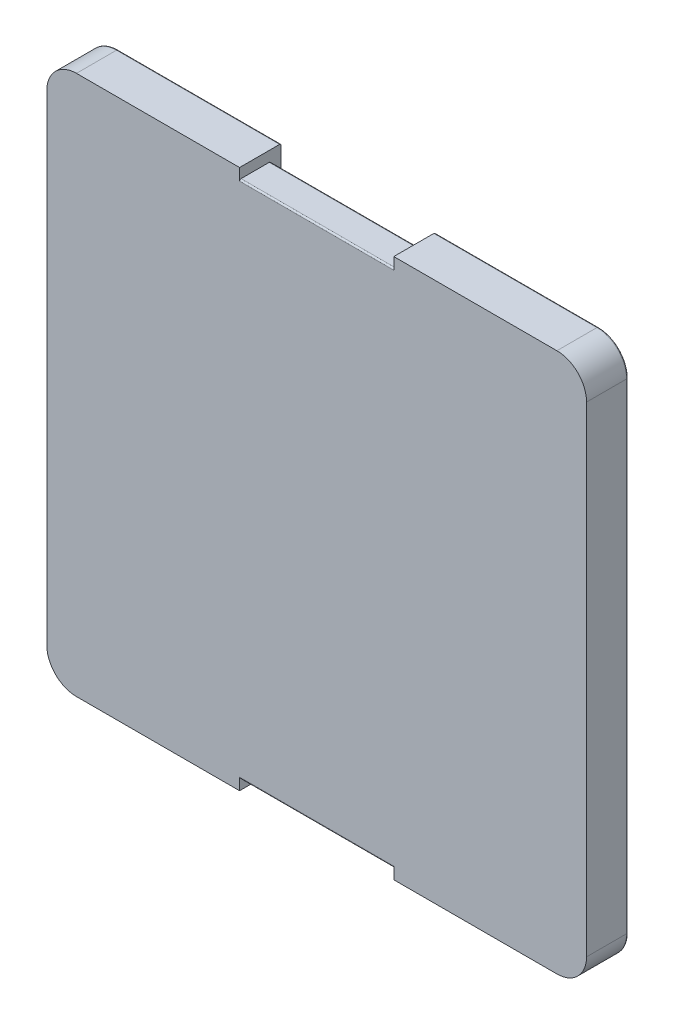
ISO-10303-21;
HEADER;
FILE_DESCRIPTION(('STEP AP214'),'2;1');
FILE_NAME('part.step','',(''),(''),'','','');
FILE_SCHEMA(('AUTOMOTIVE_DESIGN { 1 0 10303 214 1 1 1 1 }'));
ENDSEC;
DATA;
#1=APPLICATION_CONTEXT('core data for automotive mechanical design processes');
#2=APPLICATION_PROTOCOL_DEFINITION('international standard','automotive_design',2000,#1);
#3=PRODUCT_CONTEXT('',#1,'mechanical');
#4=PRODUCT('Part','Part','',(#3));
#5=PRODUCT_RELATED_PRODUCT_CATEGORY('part','',(#4));
#6=PRODUCT_DEFINITION_FORMATION('','',#4);
#7=PRODUCT_DEFINITION_CONTEXT('part definition',#1,'design');
#8=PRODUCT_DEFINITION('design','',#6,#7);
#9=PRODUCT_DEFINITION_SHAPE('','',#8);
#10=(LENGTH_UNIT() NAMED_UNIT(*) SI_UNIT(.MILLI.,.METRE.));
#11=(NAMED_UNIT(*) PLANE_ANGLE_UNIT() SI_UNIT($,.RADIAN.));
#12=(NAMED_UNIT(*) SI_UNIT($,.STERADIAN.) SOLID_ANGLE_UNIT());
#13=UNCERTAINTY_MEASURE_WITH_UNIT(LENGTH_MEASURE(1.E-05),#10,'distance_accuracy_value','');
#14=(GEOMETRIC_REPRESENTATION_CONTEXT(3) GLOBAL_UNCERTAINTY_ASSIGNED_CONTEXT((#13)) GLOBAL_UNIT_ASSIGNED_CONTEXT((#10,
#11,#12)) REPRESENTATION_CONTEXT('',''));
#15=CARTESIAN_POINT('',(0.,0.,0.));
#16=DIRECTION('',(0.,0.,1.));
#17=DIRECTION('',(1.,0.,0.));
#18=AXIS2_PLACEMENT_3D('',#15,#16,#17);
#19=CARTESIAN_POINT('',(9.1,9.1,1.4));
#20=DIRECTION('',(0.,-1.,0.));
#21=DIRECTION('',(0.,0.,-1.));
#22=AXIS2_PLACEMENT_3D('',#19,#20,#21);
#23=PLANE('',#22);
#24=DIRECTION('',(0.,0.,-1.));
#25=VECTOR('',#24,1.);
#26=CARTESIAN_POINT('',(-2.6,9.1,0.35));
#27=LINE('',#26,#25);
#28=CARTESIAN_POINT('',(-2.6,9.1,1.4));
#29=VERTEX_POINT('',#28);
#30=CARTESIAN_POINT('',(-2.6,9.1,0.0499999999999999));
#31=VERTEX_POINT('',#30);
#32=EDGE_CURVE('E11',#29,#31,#27,.T.);
#33=ORIENTED_EDGE('',*,*,#32,.T.);
#34=DIRECTION('',(-1.,0.,0.));
#35=VECTOR('',#34,1.);
#36=CARTESIAN_POINT('',(9.1,9.1,0.0499999999999999));
#37=LINE('',#36,#35);
#38=CARTESIAN_POINT('',(-8.1,9.1,0.0499999999999999));
#39=VERTEX_POINT('',#38);
#40=EDGE_CURVE('E24',#31,#39,#37,.T.);
#41=ORIENTED_EDGE('',*,*,#40,.T.);
#42=DIRECTION('',(0.,0.,-1.));
#43=VECTOR('',#42,1.);
#44=CARTESIAN_POINT('',(-8.1,9.1,1.4));
#45=LINE('',#44,#43);
#46=CARTESIAN_POINT('',(-8.1,9.1,1.4));
#47=VERTEX_POINT('',#46);
#48=EDGE_CURVE('E439',#47,#39,#45,.T.);
#49=ORIENTED_EDGE('',*,*,#48,.F.);
#50=DIRECTION('',(-1.,0.,0.));
#51=VECTOR('',#50,1.);
#52=CARTESIAN_POINT('',(9.1,9.1,1.4));
#53=LINE('',#52,#51);
#54=EDGE_CURVE('E436',#29,#47,#53,.T.);
#55=ORIENTED_EDGE('',*,*,#54,.F.);
#56=EDGE_LOOP('',(#33,#41,#49,#55));
#57=FACE_BOUND('',#56,.T.);
#58=ADVANCED_FACE('F17',(#57),#23,.F.);
#59=CARTESIAN_POINT('',(9.1,9.1,1.4));
#60=DIRECTION('',(0.,-1.,0.));
#61=DIRECTION('',(0.,0.,-1.));
#62=AXIS2_PLACEMENT_3D('',#59,#60,#61);
#63=PLANE('',#62);
#64=DIRECTION('',(0.,0.,-1.));
#65=VECTOR('',#64,1.);
#66=CARTESIAN_POINT('',(8.1,9.1,1.4));
#67=LINE('',#66,#65);
#68=CARTESIAN_POINT('',(8.1,9.1,1.4));
#69=VERTEX_POINT('',#68);
#70=CARTESIAN_POINT('',(8.1,9.1,0.0499999999999999));
#71=VERTEX_POINT('',#70);
#72=EDGE_CURVE('E434',#69,#71,#67,.T.);
#73=ORIENTED_EDGE('',*,*,#72,.T.);
#74=DIRECTION('',(-1.,0.,0.));
#75=VECTOR('',#74,1.);
#76=CARTESIAN_POINT('',(9.1,9.1,0.0499999999999999));
#77=LINE('',#76,#75);
#78=CARTESIAN_POINT('',(2.6,9.1,0.0499999999999999));
#79=VERTEX_POINT('',#78);
#80=EDGE_CURVE('E432',#71,#79,#77,.T.);
#81=ORIENTED_EDGE('',*,*,#80,.T.);
#82=DIRECTION('',(0.,0.,-1.));
#83=VECTOR('',#82,1.);
#84=CARTESIAN_POINT('',(2.6,9.1,0.35));
#85=LINE('',#84,#83);
#86=CARTESIAN_POINT('',(2.6,9.1,1.4));
#87=VERTEX_POINT('',#86);
#88=EDGE_CURVE('E429',#87,#79,#85,.T.);
#89=ORIENTED_EDGE('',*,*,#88,.F.);
#90=DIRECTION('',(-1.,0.,0.));
#91=VECTOR('',#90,1.);
#92=CARTESIAN_POINT('',(9.1,9.1,1.4));
#93=LINE('',#92,#91);
#94=EDGE_CURVE('E426',#69,#87,#93,.T.);
#95=ORIENTED_EDGE('',*,*,#94,.F.);
#96=EDGE_LOOP('',(#73,#81,#89,#95));
#97=FACE_BOUND('',#96,.T.);
#98=ADVANCED_FACE('F584',(#97),#63,.F.);
#99=CARTESIAN_POINT('',(-9.1,-9.1,1.4));
#100=DIRECTION('',(0.,0.,1.));
#101=DIRECTION('',(1.,0.,0.));
#102=AXIS2_PLACEMENT_3D('',#99,#100,#101);
#103=PLANE('',#102);
#104=DIRECTION('',(-1.,0.,0.));
#105=VECTOR('',#104,1.);
#106=CARTESIAN_POINT('',(-9.1,8.7,1.4));
#107=LINE('',#106,#105);
#108=CARTESIAN_POINT('',(2.6,8.7,1.4));
#109=VERTEX_POINT('',#108);
#110=CARTESIAN_POINT('',(-2.6,8.7,1.4));
#111=VERTEX_POINT('',#110);
#112=EDGE_CURVE('E424',#109,#111,#107,.T.);
#113=ORIENTED_EDGE('',*,*,#112,.T.);
#114=DIRECTION('',(0.,1.,0.));
#115=VECTOR('',#114,1.);
#116=CARTESIAN_POINT('',(-2.6,-9.1,1.4));
#117=LINE('',#116,#115);
#118=EDGE_CURVE('E421',#111,#29,#117,.T.);
#119=ORIENTED_EDGE('',*,*,#118,.T.);
#120=ORIENTED_EDGE('',*,*,#54,.T.);
#121=CARTESIAN_POINT('',(-8.1,8.1,1.4));
#122=DIRECTION('',(0.,0.,1.));
#123=DIRECTION('',(1.,0.,0.));
#124=AXIS2_PLACEMENT_3D('',#121,#122,#123);
#125=CIRCLE('',#124,1.);
#126=CARTESIAN_POINT('',(-9.1,8.1,1.4));
#127=VERTEX_POINT('',#126);
#128=EDGE_CURVE('E419',#47,#127,#125,.T.);
#129=ORIENTED_EDGE('',*,*,#128,.T.);
#130=DIRECTION('',(0.,-1.,0.));
#131=VECTOR('',#130,1.);
#132=CARTESIAN_POINT('',(-9.1,9.1,1.4));
#133=LINE('',#132,#131);
#134=CARTESIAN_POINT('',(-9.1,-8.1,1.4));
#135=VERTEX_POINT('',#134);
#136=EDGE_CURVE('E417',#127,#135,#133,.T.);
#137=ORIENTED_EDGE('',*,*,#136,.T.);
#138=CARTESIAN_POINT('',(-8.1,-8.1,1.4));
#139=DIRECTION('',(0.,0.,1.));
#140=DIRECTION('',(1.,0.,0.));
#141=AXIS2_PLACEMENT_3D('',#138,#139,#140);
#142=CIRCLE('',#141,1.);
#143=CARTESIAN_POINT('',(-8.1,-9.1,1.4));
#144=VERTEX_POINT('',#143);
#145=EDGE_CURVE('E415',#135,#144,#142,.T.);
#146=ORIENTED_EDGE('',*,*,#145,.T.);
#147=DIRECTION('',(1.,0.,0.));
#148=VECTOR('',#147,1.);
#149=CARTESIAN_POINT('',(-9.1,-9.1,1.4));
#150=LINE('',#149,#148);
#151=CARTESIAN_POINT('',(-2.6,-9.1,1.4));
#152=VERTEX_POINT('',#151);
#153=EDGE_CURVE('E413',#144,#152,#150,.T.);
#154=ORIENTED_EDGE('',*,*,#153,.T.);
#155=DIRECTION('',(0.,-1.,0.));
#156=VECTOR('',#155,1.);
#157=CARTESIAN_POINT('',(-2.6,-9.1,1.4));
#158=LINE('',#157,#156);
#159=CARTESIAN_POINT('',(-2.6,-8.7,1.4));
#160=VERTEX_POINT('',#159);
#161=EDGE_CURVE('E410',#160,#152,#158,.T.);
#162=ORIENTED_EDGE('',*,*,#161,.F.);
#163=DIRECTION('',(-1.,0.,0.));
#164=VECTOR('',#163,1.);
#165=CARTESIAN_POINT('',(2.6,-8.7,1.4));
#166=LINE('',#165,#164);
#167=CARTESIAN_POINT('',(2.6,-8.7,1.4));
#168=VERTEX_POINT('',#167);
#169=EDGE_CURVE('E407',#168,#160,#166,.T.);
#170=ORIENTED_EDGE('',*,*,#169,.F.);
#171=DIRECTION('',(0.,1.,0.));
#172=VECTOR('',#171,1.);
#173=CARTESIAN_POINT('',(2.6,-9.1,1.4));
#174=LINE('',#173,#172);
#175=CARTESIAN_POINT('',(2.6,-9.1,1.4));
#176=VERTEX_POINT('',#175);
#177=EDGE_CURVE('E404',#176,#168,#174,.T.);
#178=ORIENTED_EDGE('',*,*,#177,.F.);
#179=DIRECTION('',(1.,0.,0.));
#180=VECTOR('',#179,1.);
#181=CARTESIAN_POINT('',(-9.1,-9.1,1.4));
#182=LINE('',#181,#180);
#183=CARTESIAN_POINT('',(8.1,-9.1,1.4));
#184=VERTEX_POINT('',#183);
#185=EDGE_CURVE('E402',#176,#184,#182,.T.);
#186=ORIENTED_EDGE('',*,*,#185,.T.);
#187=CARTESIAN_POINT('',(8.1,-8.1,1.4));
#188=DIRECTION('',(0.,0.,1.));
#189=DIRECTION('',(1.,0.,0.));
#190=AXIS2_PLACEMENT_3D('',#187,#188,#189);
#191=CIRCLE('',#190,1.);
#192=CARTESIAN_POINT('',(9.1,-8.1,1.4));
#193=VERTEX_POINT('',#192);
#194=EDGE_CURVE('E400',#184,#193,#191,.T.);
#195=ORIENTED_EDGE('',*,*,#194,.T.);
#196=DIRECTION('',(0.,1.,0.));
#197=VECTOR('',#196,1.);
#198=CARTESIAN_POINT('',(9.1,-9.1,1.4));
#199=LINE('',#198,#197);
#200=CARTESIAN_POINT('',(9.1,8.1,1.4));
#201=VERTEX_POINT('',#200);
#202=EDGE_CURVE('E398',#193,#201,#199,.T.);
#203=ORIENTED_EDGE('',*,*,#202,.T.);
#204=CARTESIAN_POINT('',(8.1,8.1,1.4));
#205=DIRECTION('',(0.,0.,1.));
#206=DIRECTION('',(1.,0.,0.));
#207=AXIS2_PLACEMENT_3D('',#204,#205,#206);
#208=CIRCLE('',#207,1.);
#209=EDGE_CURVE('E395',#201,#69,#208,.T.);
#210=ORIENTED_EDGE('',*,*,#209,.T.);
#211=ORIENTED_EDGE('',*,*,#94,.T.);
#212=DIRECTION('',(0.,-1.,0.));
#213=VECTOR('',#212,1.);
#214=CARTESIAN_POINT('',(2.6,-9.1,1.4));
#215=LINE('',#214,#213);
#216=EDGE_CURVE('E392',#87,#109,#215,.T.);
#217=ORIENTED_EDGE('',*,*,#216,.T.);
#218=EDGE_LOOP('',(#113,#119,#120,#129,#137,#146,#154,#162,#170,#178,#186,#195,#203,#210,#211,#217));
#219=FACE_BOUND('',#218,.T.);
#220=ADVANCED_FACE('F514',(#219),#103,.T.);
#221=CARTESIAN_POINT('',(2.6,3.75,0.35));
#222=DIRECTION('',(0.,0.,-1.));
#223=DIRECTION('',(-1.,0.,0.));
#224=AXIS2_PLACEMENT_3D('',#221,#222,#223);
#225=PLANE('',#224);
#226=DIRECTION('',(0.,1.,0.));
#227=VECTOR('',#226,1.);
#228=CARTESIAN_POINT('',(-2.6,3.75,0.35));
#229=LINE('',#228,#227);
#230=CARTESIAN_POINT('',(-2.6,3.75,0.35));
#231=VERTEX_POINT('',#230);
#232=CARTESIAN_POINT('',(-2.6,8.7,0.35));
#233=VERTEX_POINT('',#232);
#234=EDGE_CURVE('E390',#231,#233,#229,.T.);
#235=ORIENTED_EDGE('',*,*,#234,.T.);
#236=DIRECTION('',(1.,0.,0.));
#237=VECTOR('',#236,1.);
#238=CARTESIAN_POINT('',(2.6,8.7,0.35));
#239=LINE('',#238,#237);
#240=CARTESIAN_POINT('',(2.6,8.7,0.35));
#241=VERTEX_POINT('',#240);
#242=EDGE_CURVE('E227',#233,#241,#239,.T.);
#243=ORIENTED_EDGE('',*,*,#242,.T.);
#244=DIRECTION('',(0.,-1.,0.));
#245=VECTOR('',#244,1.);
#246=CARTESIAN_POINT('',(2.6,9.1,0.35));
#247=LINE('',#246,#245);
#248=CARTESIAN_POINT('',(2.6,3.75,0.35));
#249=VERTEX_POINT('',#248);
#250=EDGE_CURVE('E387',#241,#249,#247,.T.);
#251=ORIENTED_EDGE('',*,*,#250,.T.);
#252=DIRECTION('',(-1.,0.,0.));
#253=VECTOR('',#252,1.);
#254=CARTESIAN_POINT('',(2.6,3.75,0.35));
#255=LINE('',#254,#253);
#256=EDGE_CURVE('E384',#249,#231,#255,.T.);
#257=ORIENTED_EDGE('',*,*,#256,.T.);
#258=EDGE_LOOP('',(#235,#243,#251,#257));
#259=FACE_BOUND('',#258,.T.);
#260=ADVANCED_FACE('F573',(#259),#225,.T.);
#261=CARTESIAN_POINT('',(-9.1,-9.1,1.4));
#262=DIRECTION('',(0.,1.,0.));
#263=DIRECTION('',(0.,0.,1.));
#264=AXIS2_PLACEMENT_3D('',#261,#262,#263);
#265=PLANE('',#264);
#266=DIRECTION('',(0.,0.,-1.));
#267=VECTOR('',#266,1.);
#268=CARTESIAN_POINT('',(-8.1,-9.1,1.4));
#269=LINE('',#268,#267);
#270=CARTESIAN_POINT('',(-8.1,-9.1,0.0499999999999999));
#271=VERTEX_POINT('',#270);
#272=EDGE_CURVE('E382',#144,#271,#269,.T.);
#273=ORIENTED_EDGE('',*,*,#272,.T.);
#274=DIRECTION('',(1.,0.,0.));
#275=VECTOR('',#274,1.);
#276=CARTESIAN_POINT('',(-9.1,-9.1,0.0499999999999999));
#277=LINE('',#276,#275);
#278=CARTESIAN_POINT('',(-2.6,-9.1,0.0499999999999999));
#279=VERTEX_POINT('',#278);
#280=EDGE_CURVE('E380',#271,#279,#277,.T.);
#281=ORIENTED_EDGE('',*,*,#280,.T.);
#282=DIRECTION('',(0.,0.,-1.));
#283=VECTOR('',#282,1.);
#284=CARTESIAN_POINT('',(-2.6,-9.1,0.35));
#285=LINE('',#284,#283);
#286=EDGE_CURVE('E377',#152,#279,#285,.T.);
#287=ORIENTED_EDGE('',*,*,#286,.F.);
#288=ORIENTED_EDGE('',*,*,#153,.F.);
#289=EDGE_LOOP('',(#273,#281,#287,#288));
#290=FACE_BOUND('',#289,.T.);
#291=ADVANCED_FACE('F570',(#290),#265,.F.);
#292=CARTESIAN_POINT('',(-9.1,-9.1,1.4));
#293=DIRECTION('',(0.,1.,0.));
#294=DIRECTION('',(0.,0.,1.));
#295=AXIS2_PLACEMENT_3D('',#292,#293,#294);
#296=PLANE('',#295);
#297=DIRECTION('',(0.,0.,-1.));
#298=VECTOR('',#297,1.);
#299=CARTESIAN_POINT('',(2.6,-9.1,0.35));
#300=LINE('',#299,#298);
#301=CARTESIAN_POINT('',(2.6,-9.1,0.0499999999999999));
#302=VERTEX_POINT('',#301);
#303=EDGE_CURVE('E375',#176,#302,#300,.T.);
#304=ORIENTED_EDGE('',*,*,#303,.T.);
#305=DIRECTION('',(1.,0.,0.));
#306=VECTOR('',#305,1.);
#307=CARTESIAN_POINT('',(-9.1,-9.1,0.0499999999999999));
#308=LINE('',#307,#306);
#309=CARTESIAN_POINT('',(8.1,-9.1,0.0499999999999999));
#310=VERTEX_POINT('',#309);
#311=EDGE_CURVE('E373',#302,#310,#308,.T.);
#312=ORIENTED_EDGE('',*,*,#311,.T.);
#313=DIRECTION('',(0.,0.,-1.));
#314=VECTOR('',#313,1.);
#315=CARTESIAN_POINT('',(8.1,-9.1,1.4));
#316=LINE('',#315,#314);
#317=EDGE_CURVE('E370',#184,#310,#316,.T.);
#318=ORIENTED_EDGE('',*,*,#317,.F.);
#319=ORIENTED_EDGE('',*,*,#185,.F.);
#320=EDGE_LOOP('',(#304,#312,#318,#319));
#321=FACE_BOUND('',#320,.T.);
#322=ADVANCED_FACE('F517',(#321),#296,.F.);
#323=CARTESIAN_POINT('',(-9.1,-9.1,0.));
#324=DIRECTION('',(0.,0.,1.));
#325=DIRECTION('',(1.,0.,0.));
#326=AXIS2_PLACEMENT_3D('',#323,#324,#325);
#327=PLANE('',#326);
#328=CARTESIAN_POINT('',(-8.1,8.1,0.));
#329=DIRECTION('',(0.,0.,1.));
#330=DIRECTION('',(1.,0.,0.));
#331=AXIS2_PLACEMENT_3D('',#328,#329,#330);
#332=CIRCLE('',#331,0.95);
#333=CARTESIAN_POINT('',(-8.1,9.05,0.));
#334=VERTEX_POINT('',#333);
#335=CARTESIAN_POINT('',(-9.05,8.1,0.));
#336=VERTEX_POINT('',#335);
#337=EDGE_CURVE('E368',#334,#336,#332,.T.);
#338=ORIENTED_EDGE('',*,*,#337,.F.);
#339=DIRECTION('',(-1.,0.,0.));
#340=VECTOR('',#339,1.);
#341=CARTESIAN_POINT('',(-9.1,9.05,0.));
#342=LINE('',#341,#340);
#343=CARTESIAN_POINT('',(-2.6,9.05,0.));
#344=VERTEX_POINT('',#343);
#345=EDGE_CURVE('E365',#344,#334,#342,.T.);
#346=ORIENTED_EDGE('',*,*,#345,.F.);
#347=DIRECTION('',(0.,1.,0.));
#348=VECTOR('',#347,1.);
#349=CARTESIAN_POINT('',(-2.6,3.75,0.));
#350=LINE('',#349,#348);
#351=CARTESIAN_POINT('',(-2.6,3.75,0.));
#352=VERTEX_POINT('',#351);
#353=EDGE_CURVE('E363',#352,#344,#350,.T.);
#354=ORIENTED_EDGE('',*,*,#353,.F.);
#355=DIRECTION('',(-1.,0.,0.));
#356=VECTOR('',#355,1.);
#357=CARTESIAN_POINT('',(2.6,3.75,0.));
#358=LINE('',#357,#356);
#359=CARTESIAN_POINT('',(2.6,3.75,0.));
#360=VERTEX_POINT('',#359);
#361=EDGE_CURVE('E360',#360,#352,#358,.T.);
#362=ORIENTED_EDGE('',*,*,#361,.F.);
#363=DIRECTION('',(0.,-1.,0.));
#364=VECTOR('',#363,1.);
#365=CARTESIAN_POINT('',(2.6,9.1,0.));
#366=LINE('',#365,#364);
#367=CARTESIAN_POINT('',(2.6,9.05,0.));
#368=VERTEX_POINT('',#367);
#369=EDGE_CURVE('E357',#368,#360,#366,.T.);
#370=ORIENTED_EDGE('',*,*,#369,.F.);
#371=DIRECTION('',(-1.,0.,0.));
#372=VECTOR('',#371,1.);
#373=CARTESIAN_POINT('',(-9.1,9.05,0.));
#374=LINE('',#373,#372);
#375=CARTESIAN_POINT('',(8.1,9.05,0.));
#376=VERTEX_POINT('',#375);
#377=EDGE_CURVE('E354',#376,#368,#374,.T.);
#378=ORIENTED_EDGE('',*,*,#377,.F.);
#379=CARTESIAN_POINT('',(8.1,8.1,0.));
#380=DIRECTION('',(0.,0.,1.));
#381=DIRECTION('',(1.,0.,0.));
#382=AXIS2_PLACEMENT_3D('',#379,#380,#381);
#383=CIRCLE('',#382,0.95);
#384=CARTESIAN_POINT('',(9.05,8.1,0.));
#385=VERTEX_POINT('',#384);
#386=EDGE_CURVE('E351',#385,#376,#383,.T.);
#387=ORIENTED_EDGE('',*,*,#386,.F.);
#388=DIRECTION('',(0.,1.,0.));
#389=VECTOR('',#388,1.);
#390=CARTESIAN_POINT('',(9.05,-9.1,0.));
#391=LINE('',#390,#389);
#392=CARTESIAN_POINT('',(9.05,-8.1,0.));
#393=VERTEX_POINT('',#392);
#394=EDGE_CURVE('E348',#393,#385,#391,.T.);
#395=ORIENTED_EDGE('',*,*,#394,.F.);
#396=CARTESIAN_POINT('',(8.1,-8.1,0.));
#397=DIRECTION('',(0.,0.,1.));
#398=DIRECTION('',(1.,0.,0.));
#399=AXIS2_PLACEMENT_3D('',#396,#397,#398);
#400=CIRCLE('',#399,0.95);
#401=CARTESIAN_POINT('',(8.1,-9.05,0.));
#402=VERTEX_POINT('',#401);
#403=EDGE_CURVE('E345',#402,#393,#400,.T.);
#404=ORIENTED_EDGE('',*,*,#403,.F.);
#405=DIRECTION('',(1.,0.,0.));
#406=VECTOR('',#405,1.);
#407=CARTESIAN_POINT('',(-9.1,-9.05,0.));
#408=LINE('',#407,#406);
#409=CARTESIAN_POINT('',(2.6,-9.05,0.));
#410=VERTEX_POINT('',#409);
#411=EDGE_CURVE('E342',#410,#402,#408,.T.);
#412=ORIENTED_EDGE('',*,*,#411,.F.);
#413=DIRECTION('',(0.,1.,0.));
#414=VECTOR('',#413,1.);
#415=CARTESIAN_POINT('',(2.6,-9.1,0.));
#416=LINE('',#415,#414);
#417=CARTESIAN_POINT('',(2.6,-3.75,0.));
#418=VERTEX_POINT('',#417);
#419=EDGE_CURVE('E340',#410,#418,#416,.T.);
#420=ORIENTED_EDGE('',*,*,#419,.T.);
#421=DIRECTION('',(-1.,0.,0.));
#422=VECTOR('',#421,1.);
#423=CARTESIAN_POINT('',(2.6,-3.75,0.));
#424=LINE('',#423,#422);
#425=CARTESIAN_POINT('',(-2.6,-3.75,0.));
#426=VERTEX_POINT('',#425);
#427=EDGE_CURVE('E338',#418,#426,#424,.T.);
#428=ORIENTED_EDGE('',*,*,#427,.T.);
#429=DIRECTION('',(0.,-1.,0.));
#430=VECTOR('',#429,1.);
#431=CARTESIAN_POINT('',(-2.6,-3.75,0.));
#432=LINE('',#431,#430);
#433=CARTESIAN_POINT('',(-2.6,-9.05,0.));
#434=VERTEX_POINT('',#433);
#435=EDGE_CURVE('E336',#426,#434,#432,.T.);
#436=ORIENTED_EDGE('',*,*,#435,.T.);
#437=DIRECTION('',(1.,0.,0.));
#438=VECTOR('',#437,1.);
#439=CARTESIAN_POINT('',(-9.1,-9.05,0.));
#440=LINE('',#439,#438);
#441=CARTESIAN_POINT('',(-8.1,-9.05,0.));
#442=VERTEX_POINT('',#441);
#443=EDGE_CURVE('E333',#442,#434,#440,.T.);
#444=ORIENTED_EDGE('',*,*,#443,.F.);
#445=CARTESIAN_POINT('',(-8.1,-8.1,0.));
#446=DIRECTION('',(0.,0.,1.));
#447=DIRECTION('',(1.,0.,0.));
#448=AXIS2_PLACEMENT_3D('',#445,#446,#447);
#449=CIRCLE('',#448,0.95);
#450=CARTESIAN_POINT('',(-9.05,-8.1,0.));
#451=VERTEX_POINT('',#450);
#452=EDGE_CURVE('E330',#451,#442,#449,.T.);
#453=ORIENTED_EDGE('',*,*,#452,.F.);
#454=DIRECTION('',(0.,-1.,0.));
#455=VECTOR('',#454,1.);
#456=CARTESIAN_POINT('',(-9.05,-9.1,0.));
#457=LINE('',#456,#455);
#458=EDGE_CURVE('E327',#336,#451,#457,.T.);
#459=ORIENTED_EDGE('',*,*,#458,.F.);
#460=EDGE_LOOP('',(#338,#346,#354,#362,#370,#378,#387,#395,#404,#412,#420,#428,#436,#444,#453,#459));
#461=FACE_BOUND('',#460,.T.);
#462=ADVANCED_FACE('F485',(#461),#327,.F.);
#463=CARTESIAN_POINT('',(-9.1,9.1,1.4));
#464=DIRECTION('',(1.,0.,0.));
#465=DIRECTION('',(0.,0.,-1.));
#466=AXIS2_PLACEMENT_3D('',#463,#464,#465);
#467=PLANE('',#466);
#468=DIRECTION('',(0.,0.,-1.));
#469=VECTOR('',#468,1.);
#470=CARTESIAN_POINT('',(-9.1,8.1,1.4));
#471=LINE('',#470,#469);
#472=CARTESIAN_POINT('',(-9.1,8.1,0.0499999999999999));
#473=VERTEX_POINT('',#472);
#474=EDGE_CURVE('E325',#127,#473,#471,.T.);
#475=ORIENTED_EDGE('',*,*,#474,.T.);
#476=DIRECTION('',(0.,-1.,0.));
#477=VECTOR('',#476,1.);
#478=CARTESIAN_POINT('',(-9.1,9.1,0.0499999999999999));
#479=LINE('',#478,#477);
#480=CARTESIAN_POINT('',(-9.1,-8.1,0.0499999999999999));
#481=VERTEX_POINT('',#480);
#482=EDGE_CURVE('E323',#473,#481,#479,.T.);
#483=ORIENTED_EDGE('',*,*,#482,.T.);
#484=DIRECTION('',(0.,0.,-1.));
#485=VECTOR('',#484,1.);
#486=CARTESIAN_POINT('',(-9.1,-8.1,1.4));
#487=LINE('',#486,#485);
#488=EDGE_CURVE('E320',#135,#481,#487,.T.);
#489=ORIENTED_EDGE('',*,*,#488,.F.);
#490=ORIENTED_EDGE('',*,*,#136,.F.);
#491=EDGE_LOOP('',(#475,#483,#489,#490));
#492=FACE_BOUND('',#491,.T.);
#493=ADVANCED_FACE('F551',(#492),#467,.F.);
#494=CARTESIAN_POINT('',(9.1,-9.1,1.4));
#495=DIRECTION('',(-1.,0.,0.));
#496=DIRECTION('',(0.,0.,1.));
#497=AXIS2_PLACEMENT_3D('',#494,#495,#496);
#498=PLANE('',#497);
#499=DIRECTION('',(0.,0.,-1.));
#500=VECTOR('',#499,1.);
#501=CARTESIAN_POINT('',(9.1,-8.1,1.4));
#502=LINE('',#501,#500);
#503=CARTESIAN_POINT('',(9.1,-8.1,0.0499999999999999));
#504=VERTEX_POINT('',#503);
#505=EDGE_CURVE('E318',#193,#504,#502,.T.);
#506=ORIENTED_EDGE('',*,*,#505,.T.);
#507=DIRECTION('',(0.,1.,0.));
#508=VECTOR('',#507,1.);
#509=CARTESIAN_POINT('',(9.1,-9.1,0.0499999999999999));
#510=LINE('',#509,#508);
#511=CARTESIAN_POINT('',(9.1,8.1,0.0499999999999999));
#512=VERTEX_POINT('',#511);
#513=EDGE_CURVE('E316',#504,#512,#510,.T.);
#514=ORIENTED_EDGE('',*,*,#513,.T.);
#515=DIRECTION('',(0.,0.,-1.));
#516=VECTOR('',#515,1.);
#517=CARTESIAN_POINT('',(9.1,8.1,1.4));
#518=LINE('',#517,#516);
#519=EDGE_CURVE('E313',#201,#512,#518,.T.);
#520=ORIENTED_EDGE('',*,*,#519,.F.);
#521=ORIENTED_EDGE('',*,*,#202,.F.);
#522=EDGE_LOOP('',(#506,#514,#520,#521));
#523=FACE_BOUND('',#522,.T.);
#524=ADVANCED_FACE('F526',(#523),#498,.F.);
#525=CARTESIAN_POINT('',(8.1,-8.1,1.4));
#526=DIRECTION('',(0.,0.,-1.));
#527=DIRECTION('',(-1.,0.,0.));
#528=AXIS2_PLACEMENT_3D('',#525,#526,#527);
#529=CYLINDRICAL_SURFACE('',#528,1.);
#530=ORIENTED_EDGE('',*,*,#317,.T.);
#531=CARTESIAN_POINT('',(8.1,-8.1,0.0499999999999999));
#532=DIRECTION('',(0.,0.,1.));
#533=DIRECTION('',(1.,0.,0.));
#534=AXIS2_PLACEMENT_3D('',#531,#532,#533);
#535=CIRCLE('',#534,1.);
#536=EDGE_CURVE('E310',#310,#504,#535,.T.);
#537=ORIENTED_EDGE('',*,*,#536,.T.);
#538=ORIENTED_EDGE('',*,*,#505,.F.);
#539=ORIENTED_EDGE('',*,*,#194,.F.);
#540=EDGE_LOOP('',(#530,#537,#538,#539));
#541=FACE_BOUND('',#540,.T.);
#542=ADVANCED_FACE('F523',(#541),#529,.T.);
#543=CARTESIAN_POINT('',(8.1,8.1,1.4));
#544=DIRECTION('',(0.,0.,-1.));
#545=DIRECTION('',(-1.,0.,0.));
#546=AXIS2_PLACEMENT_3D('',#543,#544,#545);
#547=CYLINDRICAL_SURFACE('',#546,1.);
#548=ORIENTED_EDGE('',*,*,#519,.T.);
#549=CARTESIAN_POINT('',(8.1,8.1,0.0499999999999999));
#550=DIRECTION('',(0.,0.,1.));
#551=DIRECTION('',(1.,0.,0.));
#552=AXIS2_PLACEMENT_3D('',#549,#550,#551);
#553=CIRCLE('',#552,1.);
#554=EDGE_CURVE('E307',#512,#71,#553,.T.);
#555=ORIENTED_EDGE('',*,*,#554,.T.);
#556=ORIENTED_EDGE('',*,*,#72,.F.);
#557=ORIENTED_EDGE('',*,*,#209,.F.);
#558=EDGE_LOOP('',(#548,#555,#556,#557));
#559=FACE_BOUND('',#558,.T.);
#560=ADVANCED_FACE('F536',(#559),#547,.T.);
#561=CARTESIAN_POINT('',(-8.1,8.1,1.4));
#562=DIRECTION('',(0.,0.,-1.));
#563=DIRECTION('',(-1.,0.,0.));
#564=AXIS2_PLACEMENT_3D('',#561,#562,#563);
#565=CYLINDRICAL_SURFACE('',#564,1.);
#566=ORIENTED_EDGE('',*,*,#48,.T.);
#567=CARTESIAN_POINT('',(-8.1,8.1,0.0499999999999999));
#568=DIRECTION('',(0.,0.,1.));
#569=DIRECTION('',(1.,0.,0.));
#570=AXIS2_PLACEMENT_3D('',#567,#568,#569);
#571=CIRCLE('',#570,1.);
#572=EDGE_CURVE('E304',#39,#473,#571,.T.);
#573=ORIENTED_EDGE('',*,*,#572,.T.);
#574=ORIENTED_EDGE('',*,*,#474,.F.);
#575=ORIENTED_EDGE('',*,*,#128,.F.);
#576=EDGE_LOOP('',(#566,#573,#574,#575));
#577=FACE_BOUND('',#576,.T.);
#578=ADVANCED_FACE('F446',(#577),#565,.T.);
#579=CARTESIAN_POINT('',(-8.1,-8.1,1.4));
#580=DIRECTION('',(0.,0.,-1.));
#581=DIRECTION('',(-1.,0.,0.));
#582=AXIS2_PLACEMENT_3D('',#579,#580,#581);
#583=CYLINDRICAL_SURFACE('',#582,1.);
#584=ORIENTED_EDGE('',*,*,#488,.T.);
#585=CARTESIAN_POINT('',(-8.1,-8.1,0.0499999999999999));
#586=DIRECTION('',(0.,0.,1.));
#587=DIRECTION('',(1.,0.,0.));
#588=AXIS2_PLACEMENT_3D('',#585,#586,#587);
#589=CIRCLE('',#588,1.);
#590=EDGE_CURVE('E301',#481,#271,#589,.T.);
#591=ORIENTED_EDGE('',*,*,#590,.T.);
#592=ORIENTED_EDGE('',*,*,#272,.F.);
#593=ORIENTED_EDGE('',*,*,#145,.F.);
#594=EDGE_LOOP('',(#584,#591,#592,#593));
#595=FACE_BOUND('',#594,.T.);
#596=ADVANCED_FACE('F555',(#595),#583,.T.);
#597=CARTESIAN_POINT('',(2.6,-9.1,0.35));
#598=DIRECTION('',(-1.,0.,0.));
#599=DIRECTION('',(0.,-1.,0.));
#600=AXIS2_PLACEMENT_3D('',#597,#598,#599);
#601=PLANE('',#600);
#602=ORIENTED_EDGE('',*,*,#419,.F.);
#603=CARTESIAN_POINT('',(2.6,-9.05,0.0499999999999999));
#604=DIRECTION('',(-1.,0.,0.));
#605=DIRECTION('',(0.,-1.,0.));
#606=AXIS2_PLACEMENT_3D('',#603,#604,#605);
#607=CIRCLE('',#606,0.05);
#608=EDGE_CURVE('E298',#410,#302,#607,.T.);
#609=ORIENTED_EDGE('',*,*,#608,.T.);
#610=ORIENTED_EDGE('',*,*,#303,.F.);
#611=ORIENTED_EDGE('',*,*,#177,.T.);
#612=CARTESIAN_POINT('',(2.6,-8.7,1.35));
#613=DIRECTION('',(-1.,0.,0.));
#614=DIRECTION('',(0.,-1.,0.));
#615=AXIS2_PLACEMENT_3D('',#612,#613,#614);
#616=CIRCLE('',#615,0.05);
#617=CARTESIAN_POINT('',(2.6,-8.75,1.35));
#618=VERTEX_POINT('',#617);
#619=EDGE_CURVE('E295',#618,#168,#616,.T.);
#620=ORIENTED_EDGE('',*,*,#619,.F.);
#621=DIRECTION('',(0.,0.,-1.));
#622=VECTOR('',#621,1.);
#623=CARTESIAN_POINT('',(2.6,-8.75,25.812061134284));
#624=LINE('',#623,#622);
#625=CARTESIAN_POINT('',(2.6,-8.75,0.400000000000001));
#626=VERTEX_POINT('',#625);
#627=EDGE_CURVE('E293',#618,#626,#624,.T.);
#628=ORIENTED_EDGE('',*,*,#627,.T.);
#629=CARTESIAN_POINT('',(2.6,-8.7,0.4));
#630=DIRECTION('',(-1.,0.,0.));
#631=DIRECTION('',(0.,-1.,0.));
#632=AXIS2_PLACEMENT_3D('',#629,#630,#631);
#633=CIRCLE('',#632,0.05);
#634=CARTESIAN_POINT('',(2.6,-8.7,0.35));
#635=VERTEX_POINT('',#634);
#636=EDGE_CURVE('E290',#635,#626,#633,.T.);
#637=ORIENTED_EDGE('',*,*,#636,.F.);
#638=DIRECTION('',(0.,1.,0.));
#639=VECTOR('',#638,1.);
#640=CARTESIAN_POINT('',(2.6,-9.1,0.35));
#641=LINE('',#640,#639);
#642=CARTESIAN_POINT('',(2.6,-3.75,0.35));
#643=VERTEX_POINT('',#642);
#644=EDGE_CURVE('E288',#635,#643,#641,.T.);
#645=ORIENTED_EDGE('',*,*,#644,.T.);
#646=DIRECTION('',(0.,0.,-1.));
#647=VECTOR('',#646,1.);
#648=CARTESIAN_POINT('',(2.6,-3.75,0.35));
#649=LINE('',#648,#647);
#650=EDGE_CURVE('E285',#643,#418,#649,.T.);
#651=ORIENTED_EDGE('',*,*,#650,.T.);
#652=EDGE_LOOP('',(#602,#609,#610,#611,#620,#628,#637,#645,#651));
#653=FACE_BOUND('',#652,.T.);
#654=ADVANCED_FACE('F488',(#653),#601,.T.);
#655=CARTESIAN_POINT('',(2.6,-3.75,0.35));
#656=DIRECTION('',(0.,-1.,0.));
#657=DIRECTION('',(1.,0.,0.));
#658=AXIS2_PLACEMENT_3D('',#655,#656,#657);
#659=PLANE('',#658);
#660=ORIENTED_EDGE('',*,*,#427,.F.);
#661=ORIENTED_EDGE('',*,*,#650,.F.);
#662=DIRECTION('',(-1.,0.,0.));
#663=VECTOR('',#662,1.);
#664=CARTESIAN_POINT('',(2.6,-3.75,0.35));
#665=LINE('',#664,#663);
#666=CARTESIAN_POINT('',(-2.6,-3.75,0.35));
#667=VERTEX_POINT('',#666);
#668=EDGE_CURVE('E283',#643,#667,#665,.T.);
#669=ORIENTED_EDGE('',*,*,#668,.T.);
#670=DIRECTION('',(0.,0.,-1.));
#671=VECTOR('',#670,1.);
#672=CARTESIAN_POINT('',(-2.6,-3.75,0.35));
#673=LINE('',#672,#671);
#674=EDGE_CURVE('E280',#667,#426,#673,.T.);
#675=ORIENTED_EDGE('',*,*,#674,.T.);
#676=EDGE_LOOP('',(#660,#661,#669,#675));
#677=FACE_BOUND('',#676,.T.);
#678=ADVANCED_FACE('F494',(#677),#659,.T.);
#679=CARTESIAN_POINT('',(-2.6,-3.75,0.35));
#680=DIRECTION('',(1.,0.,0.));
#681=DIRECTION('',(0.,1.,0.));
#682=AXIS2_PLACEMENT_3D('',#679,#680,#681);
#683=PLANE('',#682);
#684=ORIENTED_EDGE('',*,*,#286,.T.);
#685=CARTESIAN_POINT('',(-2.6,-9.05,0.0499999999999999));
#686=DIRECTION('',(1.,0.,0.));
#687=DIRECTION('',(0.,1.,0.));
#688=AXIS2_PLACEMENT_3D('',#685,#686,#687);
#689=CIRCLE('',#688,0.05);
#690=EDGE_CURVE('E277',#279,#434,#689,.T.);
#691=ORIENTED_EDGE('',*,*,#690,.T.);
#692=ORIENTED_EDGE('',*,*,#435,.F.);
#693=ORIENTED_EDGE('',*,*,#674,.F.);
#694=DIRECTION('',(0.,-1.,0.));
#695=VECTOR('',#694,1.);
#696=CARTESIAN_POINT('',(-2.6,-3.75,0.35));
#697=LINE('',#696,#695);
#698=CARTESIAN_POINT('',(-2.6,-8.7,0.35));
#699=VERTEX_POINT('',#698);
#700=EDGE_CURVE('E275',#667,#699,#697,.T.);
#701=ORIENTED_EDGE('',*,*,#700,.T.);
#702=CARTESIAN_POINT('',(-2.6,-8.7,0.4));
#703=DIRECTION('',(1.,0.,0.));
#704=DIRECTION('',(0.,1.,0.));
#705=AXIS2_PLACEMENT_3D('',#702,#703,#704);
#706=CIRCLE('',#705,0.05);
#707=CARTESIAN_POINT('',(-2.6,-8.75,0.400000000000001));
#708=VERTEX_POINT('',#707);
#709=EDGE_CURVE('E272',#708,#699,#706,.T.);
#710=ORIENTED_EDGE('',*,*,#709,.F.);
#711=DIRECTION('',(0.,0.,-1.));
#712=VECTOR('',#711,1.);
#713=CARTESIAN_POINT('',(-2.6,-8.75,25.812061134284));
#714=LINE('',#713,#712);
#715=CARTESIAN_POINT('',(-2.6,-8.75,1.35));
#716=VERTEX_POINT('',#715);
#717=EDGE_CURVE('E269',#716,#708,#714,.T.);
#718=ORIENTED_EDGE('',*,*,#717,.F.);
#719=CARTESIAN_POINT('',(-2.6,-8.7,1.35));
#720=DIRECTION('',(1.,0.,0.));
#721=DIRECTION('',(0.,1.,0.));
#722=AXIS2_PLACEMENT_3D('',#719,#720,#721);
#723=CIRCLE('',#722,0.05);
#724=EDGE_CURVE('E266',#160,#716,#723,.T.);
#725=ORIENTED_EDGE('',*,*,#724,.F.);
#726=ORIENTED_EDGE('',*,*,#161,.T.);
#727=EDGE_LOOP('',(#684,#691,#692,#693,#701,#710,#718,#725,#726));
#728=FACE_BOUND('',#727,.T.);
#729=ADVANCED_FACE('F501',(#728),#683,.T.);
#730=CARTESIAN_POINT('',(2.6,-3.75,0.35));
#731=DIRECTION('',(0.,0.,1.));
#732=DIRECTION('',(1.,0.,0.));
#733=AXIS2_PLACEMENT_3D('',#730,#731,#732);
#734=PLANE('',#733);
#735=ORIENTED_EDGE('',*,*,#644,.F.);
#736=DIRECTION('',(-1.,0.,0.));
#737=VECTOR('',#736,1.);
#738=CARTESIAN_POINT('',(2.6,-8.7,0.35));
#739=LINE('',#738,#737);
#740=EDGE_CURVE('E263',#635,#699,#739,.T.);
#741=ORIENTED_EDGE('',*,*,#740,.T.);
#742=ORIENTED_EDGE('',*,*,#700,.F.);
#743=ORIENTED_EDGE('',*,*,#668,.F.);
#744=EDGE_LOOP('',(#735,#741,#742,#743));
#745=FACE_BOUND('',#744,.T.);
#746=ADVANCED_FACE('F498',(#745),#734,.F.);
#747=CARTESIAN_POINT('',(2.6,9.1,0.35));
#748=DIRECTION('',(1.,0.,0.));
#749=DIRECTION('',(0.,1.,0.));
#750=AXIS2_PLACEMENT_3D('',#747,#748,#749);
#751=PLANE('',#750);
#752=ORIENTED_EDGE('',*,*,#88,.T.);
#753=CARTESIAN_POINT('',(2.6,9.05,0.0499999999999999));
#754=DIRECTION('',(1.,0.,0.));
#755=DIRECTION('',(0.,1.,0.));
#756=AXIS2_PLACEMENT_3D('',#753,#754,#755);
#757=CIRCLE('',#756,0.05);
#758=EDGE_CURVE('E260',#368,#79,#757,.T.);
#759=ORIENTED_EDGE('',*,*,#758,.F.);
#760=ORIENTED_EDGE('',*,*,#369,.T.);
#761=DIRECTION('',(0.,0.,-1.));
#762=VECTOR('',#761,1.);
#763=CARTESIAN_POINT('',(2.6,3.75,0.35));
#764=LINE('',#763,#762);
#765=EDGE_CURVE('E257',#249,#360,#764,.T.);
#766=ORIENTED_EDGE('',*,*,#765,.F.);
#767=ORIENTED_EDGE('',*,*,#250,.F.);
#768=CARTESIAN_POINT('',(2.6,8.7,0.4));
#769=DIRECTION('',(1.,0.,0.));
#770=DIRECTION('',(0.,1.,0.));
#771=AXIS2_PLACEMENT_3D('',#768,#769,#770);
#772=CIRCLE('',#771,0.05);
#773=CARTESIAN_POINT('',(2.6,8.75,0.400000000000001));
#774=VERTEX_POINT('',#773);
#775=EDGE_CURVE('E255',#241,#774,#772,.T.);
#776=ORIENTED_EDGE('',*,*,#775,.T.);
#777=DIRECTION('',(0.,0.,-1.));
#778=VECTOR('',#777,1.);
#779=CARTESIAN_POINT('',(2.6,8.75,25.812061134284));
#780=LINE('',#779,#778);
#781=CARTESIAN_POINT('',(2.6,8.75,1.35));
#782=VERTEX_POINT('',#781);
#783=EDGE_CURVE('E232',#782,#774,#780,.T.);
#784=ORIENTED_EDGE('',*,*,#783,.F.);
#785=CARTESIAN_POINT('',(2.6,8.7,1.35));
#786=DIRECTION('',(1.,0.,0.));
#787=DIRECTION('',(0.,1.,0.));
#788=AXIS2_PLACEMENT_3D('',#785,#786,#787);
#789=CIRCLE('',#788,0.05);
#790=EDGE_CURVE('E251',#782,#109,#789,.T.);
#791=ORIENTED_EDGE('',*,*,#790,.T.);
#792=ORIENTED_EDGE('',*,*,#216,.F.);
#793=EDGE_LOOP('',(#752,#759,#760,#766,#767,#776,#784,#791,#792));
#794=FACE_BOUND('',#793,.T.);
#795=ADVANCED_FACE('F542',(#794),#751,.F.);
#796=CARTESIAN_POINT('',(2.6,3.75,0.35));
#797=DIRECTION('',(0.,-1.,0.));
#798=DIRECTION('',(1.,0.,0.));
#799=AXIS2_PLACEMENT_3D('',#796,#797,#798);
#800=PLANE('',#799);
#801=ORIENTED_EDGE('',*,*,#361,.T.);
#802=DIRECTION('',(0.,0.,-1.));
#803=VECTOR('',#802,1.);
#804=CARTESIAN_POINT('',(-2.6,3.75,0.35));
#805=LINE('',#804,#803);
#806=EDGE_CURVE('E248',#231,#352,#805,.T.);
#807=ORIENTED_EDGE('',*,*,#806,.F.);
#808=ORIENTED_EDGE('',*,*,#256,.F.);
#809=ORIENTED_EDGE('',*,*,#765,.T.);
#810=EDGE_LOOP('',(#801,#807,#808,#809));
#811=FACE_BOUND('',#810,.T.);
#812=ADVANCED_FACE('F599',(#811),#800,.F.);
#813=CARTESIAN_POINT('',(-2.6,3.75,0.35));
#814=DIRECTION('',(-1.,0.,0.));
#815=DIRECTION('',(0.,-1.,0.));
#816=AXIS2_PLACEMENT_3D('',#813,#814,#815);
#817=PLANE('',#816);
#818=ORIENTED_EDGE('',*,*,#353,.T.);
#819=CARTESIAN_POINT('',(-2.6,9.05,0.0499999999999999));
#820=DIRECTION('',(-1.,0.,0.));
#821=DIRECTION('',(0.,-1.,0.));
#822=AXIS2_PLACEMENT_3D('',#819,#820,#821);
#823=CIRCLE('',#822,0.05);
#824=EDGE_CURVE('E245',#31,#344,#823,.T.);
#825=ORIENTED_EDGE('',*,*,#824,.F.);
#826=ORIENTED_EDGE('',*,*,#32,.F.);
#827=ORIENTED_EDGE('',*,*,#118,.F.);
#828=CARTESIAN_POINT('',(-2.6,8.7,1.35));
#829=DIRECTION('',(-1.,0.,0.));
#830=DIRECTION('',(0.,-1.,0.));
#831=AXIS2_PLACEMENT_3D('',#828,#829,#830);
#832=CIRCLE('',#831,0.05);
#833=CARTESIAN_POINT('',(-2.6,8.75,1.35));
#834=VERTEX_POINT('',#833);
#835=EDGE_CURVE('E215',#111,#834,#832,.T.);
#836=ORIENTED_EDGE('',*,*,#835,.T.);
#837=DIRECTION('',(0.,0.,-1.));
#838=VECTOR('',#837,1.);
#839=CARTESIAN_POINT('',(-2.6,8.75,25.812061134284));
#840=LINE('',#839,#838);
#841=CARTESIAN_POINT('',(-2.6,8.75,0.400000000000001));
#842=VERTEX_POINT('',#841);
#843=EDGE_CURVE('E209',#834,#842,#840,.T.);
#844=ORIENTED_EDGE('',*,*,#843,.T.);
#845=CARTESIAN_POINT('',(-2.6,8.7,0.4));
#846=DIRECTION('',(-1.,0.,0.));
#847=DIRECTION('',(0.,-1.,0.));
#848=AXIS2_PLACEMENT_3D('',#845,#846,#847);
#849=CIRCLE('',#848,0.05);
#850=EDGE_CURVE('E213',#842,#233,#849,.T.);
#851=ORIENTED_EDGE('',*,*,#850,.T.);
#852=ORIENTED_EDGE('',*,*,#234,.F.);
#853=ORIENTED_EDGE('',*,*,#806,.T.);
#854=EDGE_LOOP('',(#818,#825,#826,#827,#836,#844,#851,#852,#853));
#855=FACE_BOUND('',#854,.T.);
#856=ADVANCED_FACE('F212',(#855),#817,.F.);
#857=CARTESIAN_POINT('',(-2.6,-8.75,25.812061134284));
#858=DIRECTION('',(0.,1.,0.));
#859=DIRECTION('',(0.,0.,1.));
#860=AXIS2_PLACEMENT_3D('',#857,#858,#859);
#861=PLANE('',#860);
#862=ORIENTED_EDGE('',*,*,#717,.T.);
#863=DIRECTION('',(-1.,0.,0.));
#864=VECTOR('',#863,1.);
#865=CARTESIAN_POINT('',(-2.6,-8.75,0.400000000000001));
#866=LINE('',#865,#864);
#867=EDGE_CURVE('E228',#626,#708,#866,.T.);
#868=ORIENTED_EDGE('',*,*,#867,.F.);
#869=ORIENTED_EDGE('',*,*,#627,.F.);
#870=DIRECTION('',(-1.,0.,0.));
#871=VECTOR('',#870,1.);
#872=CARTESIAN_POINT('',(-2.6,-8.75,1.35));
#873=LINE('',#872,#871);
#874=EDGE_CURVE('E233',#618,#716,#873,.T.);
#875=ORIENTED_EDGE('',*,*,#874,.T.);
#876=EDGE_LOOP('',(#862,#868,#869,#875));
#877=FACE_BOUND('',#876,.T.);
#878=ADVANCED_FACE('F508',(#877),#861,.F.);
#879=CARTESIAN_POINT('',(-2.6,8.75,25.812061134284));
#880=DIRECTION('',(0.,1.,0.));
#881=DIRECTION('',(0.,0.,1.));
#882=AXIS2_PLACEMENT_3D('',#879,#880,#881);
#883=PLANE('',#882);
#884=ORIENTED_EDGE('',*,*,#783,.T.);
#885=DIRECTION('',(1.,0.,0.));
#886=VECTOR('',#885,1.);
#887=CARTESIAN_POINT('',(-2.6,8.75,0.400000000000001));
#888=LINE('',#887,#886);
#889=EDGE_CURVE('E226',#842,#774,#888,.T.);
#890=ORIENTED_EDGE('',*,*,#889,.F.);
#891=ORIENTED_EDGE('',*,*,#843,.F.);
#892=DIRECTION('',(-1.,0.,0.));
#893=VECTOR('',#892,1.);
#894=CARTESIAN_POINT('',(-2.6,8.75,1.35));
#895=LINE('',#894,#893);
#896=EDGE_CURVE('E234',#782,#834,#895,.T.);
#897=ORIENTED_EDGE('',*,*,#896,.F.);
#898=EDGE_LOOP('',(#884,#890,#891,#897));
#899=FACE_BOUND('',#898,.T.);
#900=ADVANCED_FACE('F231',(#899),#883,.T.);
#901=CARTESIAN_POINT('',(-9.1,-9.05,0.0499999999999999));
#902=DIRECTION('',(1.,0.,0.));
#903=DIRECTION('',(0.,0.,-1.));
#904=AXIS2_PLACEMENT_3D('',#901,#902,#903);
#905=CYLINDRICAL_SURFACE('',#904,0.05);
#906=ORIENTED_EDGE('',*,*,#608,.F.);
#907=ORIENTED_EDGE('',*,*,#411,.T.);
#908=CARTESIAN_POINT('',(8.1,-9.05,0.0499999999999999));
#909=DIRECTION('',(1.,0.,0.));
#910=DIRECTION('',(0.,0.,-1.));
#911=AXIS2_PLACEMENT_3D('',#908,#909,#910);
#912=CIRCLE('',#911,0.05);
#913=EDGE_CURVE('E238',#310,#402,#912,.T.);
#914=ORIENTED_EDGE('',*,*,#913,.F.);
#915=ORIENTED_EDGE('',*,*,#311,.F.);
#916=EDGE_LOOP('',(#906,#907,#914,#915));
#917=FACE_BOUND('',#916,.T.);
#918=ADVANCED_FACE('F482',(#917),#905,.T.);
#919=CARTESIAN_POINT('',(8.1,-8.1,0.0499999999999999));
#920=DIRECTION('',(0.,0.,1.));
#921=DIRECTION('',(1.,0.,0.));
#922=AXIS2_PLACEMENT_3D('',#919,#920,#921);
#923=TOROIDAL_SURFACE('',#922,0.95,0.05);
#924=ORIENTED_EDGE('',*,*,#913,.T.);
#925=ORIENTED_EDGE('',*,*,#403,.T.);
#926=CARTESIAN_POINT('',(9.05,-8.1,0.0499999999999999));
#927=DIRECTION('',(0.,1.,0.));
#928=DIRECTION('',(0.,0.,1.));
#929=AXIS2_PLACEMENT_3D('',#926,#927,#928);
#930=CIRCLE('',#929,0.05);
#931=EDGE_CURVE('E471',#504,#393,#930,.T.);
#932=ORIENTED_EDGE('',*,*,#931,.F.);
#933=ORIENTED_EDGE('',*,*,#536,.F.);
#934=EDGE_LOOP('',(#924,#925,#932,#933));
#935=FACE_BOUND('',#934,.T.);
#936=ADVANCED_FACE('F477',(#935),#923,.T.);
#937=CARTESIAN_POINT('',(9.05,-9.1,0.0499999999999999));
#938=DIRECTION('',(0.,1.,0.));
#939=DIRECTION('',(0.,0.,1.));
#940=AXIS2_PLACEMENT_3D('',#937,#938,#939);
#941=CYLINDRICAL_SURFACE('',#940,0.05);
#942=ORIENTED_EDGE('',*,*,#931,.T.);
#943=ORIENTED_EDGE('',*,*,#394,.T.);
#944=CARTESIAN_POINT('',(9.05,8.1,0.0499999999999999));
#945=DIRECTION('',(0.,1.,0.));
#946=DIRECTION('',(0.,0.,1.));
#947=AXIS2_PLACEMENT_3D('',#944,#945,#946);
#948=CIRCLE('',#947,0.05);
#949=EDGE_CURVE('E468',#512,#385,#948,.T.);
#950=ORIENTED_EDGE('',*,*,#949,.F.);
#951=ORIENTED_EDGE('',*,*,#513,.F.);
#952=EDGE_LOOP('',(#942,#943,#950,#951));
#953=FACE_BOUND('',#952,.T.);
#954=ADVANCED_FACE('F530',(#953),#941,.T.);
#955=CARTESIAN_POINT('',(8.1,8.1,0.0499999999999999));
#956=DIRECTION('',(0.,0.,1.));
#957=DIRECTION('',(1.,0.,0.));
#958=AXIS2_PLACEMENT_3D('',#955,#956,#957);
#959=TOROIDAL_SURFACE('',#958,0.95,0.05);
#960=ORIENTED_EDGE('',*,*,#949,.T.);
#961=ORIENTED_EDGE('',*,*,#386,.T.);
#962=CARTESIAN_POINT('',(8.1,9.05,0.0499999999999999));
#963=DIRECTION('',(-1.,0.,0.));
#964=DIRECTION('',(0.,0.,1.));
#965=AXIS2_PLACEMENT_3D('',#962,#963,#964);
#966=CIRCLE('',#965,0.05);
#967=EDGE_CURVE('E465',#71,#376,#966,.T.);
#968=ORIENTED_EDGE('',*,*,#967,.F.);
#969=ORIENTED_EDGE('',*,*,#554,.F.);
#970=EDGE_LOOP('',(#960,#961,#968,#969));
#971=FACE_BOUND('',#970,.T.);
#972=ADVANCED_FACE('F533',(#971),#959,.T.);
#973=CARTESIAN_POINT('',(9.1,9.05,0.0499999999999999));
#974=DIRECTION('',(-1.,0.,0.));
#975=DIRECTION('',(0.,0.,1.));
#976=AXIS2_PLACEMENT_3D('',#973,#974,#975);
#977=CYLINDRICAL_SURFACE('',#976,0.05);
#978=ORIENTED_EDGE('',*,*,#967,.T.);
#979=ORIENTED_EDGE('',*,*,#377,.T.);
#980=ORIENTED_EDGE('',*,*,#758,.T.);
#981=ORIENTED_EDGE('',*,*,#80,.F.);
#982=EDGE_LOOP('',(#978,#979,#980,#981));
#983=FACE_BOUND('',#982,.T.);
#984=ADVANCED_FACE('F594',(#983),#977,.T.);
#985=CARTESIAN_POINT('',(-2.6,-8.7,1.35));
#986=DIRECTION('',(1.,0.,0.));
#987=DIRECTION('',(0.,0.,-1.));
#988=AXIS2_PLACEMENT_3D('',#985,#986,#987);
#989=CYLINDRICAL_SURFACE('',#988,0.05);
#990=ORIENTED_EDGE('',*,*,#619,.T.);
#991=ORIENTED_EDGE('',*,*,#169,.T.);
#992=ORIENTED_EDGE('',*,*,#724,.T.);
#993=ORIENTED_EDGE('',*,*,#874,.F.);
#994=EDGE_LOOP('',(#990,#991,#992,#993));
#995=FACE_BOUND('',#994,.T.);
#996=ADVANCED_FACE('F512',(#995),#989,.T.);
#997=CARTESIAN_POINT('',(2.6,-8.7,0.4));
#998=DIRECTION('',(-1.,0.,0.));
#999=DIRECTION('',(0.,0.,1.));
#1000=AXIS2_PLACEMENT_3D('',#997,#998,#999);
#1001=CYLINDRICAL_SURFACE('',#1000,0.05);
#1002=ORIENTED_EDGE('',*,*,#636,.T.);
#1003=ORIENTED_EDGE('',*,*,#867,.T.);
#1004=ORIENTED_EDGE('',*,*,#709,.T.);
#1005=ORIENTED_EDGE('',*,*,#740,.F.);
#1006=EDGE_LOOP('',(#1002,#1003,#1004,#1005));
#1007=FACE_BOUND('',#1006,.T.);
#1008=ADVANCED_FACE('F504',(#1007),#1001,.T.);
#1009=CARTESIAN_POINT('',(-9.1,8.7,1.35));
#1010=DIRECTION('',(-1.,0.,0.));
#1011=DIRECTION('',(0.,0.,1.));
#1012=AXIS2_PLACEMENT_3D('',#1009,#1010,#1011);
#1013=CYLINDRICAL_SURFACE('',#1012,0.05);
#1014=ORIENTED_EDGE('',*,*,#790,.F.);
#1015=ORIENTED_EDGE('',*,*,#896,.T.);
#1016=ORIENTED_EDGE('',*,*,#835,.F.);
#1017=ORIENTED_EDGE('',*,*,#112,.F.);
#1018=EDGE_LOOP('',(#1014,#1015,#1016,#1017));
#1019=FACE_BOUND('',#1018,.T.);
#1020=ADVANCED_FACE('F546',(#1019),#1013,.T.);
#1021=CARTESIAN_POINT('',(2.6,8.7,0.4));
#1022=DIRECTION('',(1.,0.,0.));
#1023=DIRECTION('',(0.,0.,-1.));
#1024=AXIS2_PLACEMENT_3D('',#1021,#1022,#1023);
#1025=CYLINDRICAL_SURFACE('',#1024,0.05);
#1026=ORIENTED_EDGE('',*,*,#850,.F.);
#1027=ORIENTED_EDGE('',*,*,#889,.T.);
#1028=ORIENTED_EDGE('',*,*,#775,.F.);
#1029=ORIENTED_EDGE('',*,*,#242,.F.);
#1030=EDGE_LOOP('',(#1026,#1027,#1028,#1029));
#1031=FACE_BOUND('',#1030,.T.);
#1032=ADVANCED_FACE('F224',(#1031),#1025,.T.);
#1033=CARTESIAN_POINT('',(-9.1,-9.05,0.0499999999999999));
#1034=DIRECTION('',(1.,0.,0.));
#1035=DIRECTION('',(0.,0.,-1.));
#1036=AXIS2_PLACEMENT_3D('',#1033,#1034,#1035);
#1037=CYLINDRICAL_SURFACE('',#1036,0.05);
#1038=ORIENTED_EDGE('',*,*,#690,.F.);
#1039=ORIENTED_EDGE('',*,*,#280,.F.);
#1040=CARTESIAN_POINT('',(-8.1,-9.05,0.05));
#1041=DIRECTION('',(-1.,0.,0.));
#1042=DIRECTION('',(0.,0.,1.));
#1043=AXIS2_PLACEMENT_3D('',#1040,#1041,#1042);
#1044=CIRCLE('',#1043,0.05);
#1045=EDGE_CURVE('E462',#442,#271,#1044,.T.);
#1046=ORIENTED_EDGE('',*,*,#1045,.F.);
#1047=ORIENTED_EDGE('',*,*,#443,.T.);
#1048=EDGE_LOOP('',(#1038,#1039,#1046,#1047));
#1049=FACE_BOUND('',#1048,.T.);
#1050=ADVANCED_FACE('F567',(#1049),#1037,.T.);
#1051=CARTESIAN_POINT('',(-8.1,-8.1,0.0499999999999999));
#1052=DIRECTION('',(0.,0.,1.));
#1053=DIRECTION('',(1.,0.,0.));
#1054=AXIS2_PLACEMENT_3D('',#1051,#1052,#1053);
#1055=TOROIDAL_SURFACE('',#1054,0.95,0.05);
#1056=ORIENTED_EDGE('',*,*,#1045,.T.);
#1057=ORIENTED_EDGE('',*,*,#590,.F.);
#1058=CARTESIAN_POINT('',(-9.05,-8.1,0.05));
#1059=DIRECTION('',(0.,1.,0.));
#1060=DIRECTION('',(0.,0.,1.));
#1061=AXIS2_PLACEMENT_3D('',#1058,#1059,#1060);
#1062=CIRCLE('',#1061,0.05);
#1063=EDGE_CURVE('E457',#451,#481,#1062,.T.);
#1064=ORIENTED_EDGE('',*,*,#1063,.F.);
#1065=ORIENTED_EDGE('',*,*,#452,.T.);
#1066=EDGE_LOOP('',(#1056,#1057,#1064,#1065));
#1067=FACE_BOUND('',#1066,.T.);
#1068=ADVANCED_FACE('F559',(#1067),#1055,.T.);
#1069=CARTESIAN_POINT('',(-9.05,9.1,0.0499999999999999));
#1070=DIRECTION('',(0.,-1.,0.));
#1071=DIRECTION('',(0.,0.,-1.));
#1072=AXIS2_PLACEMENT_3D('',#1069,#1070,#1071);
#1073=CYLINDRICAL_SURFACE('',#1072,0.05);
#1074=ORIENTED_EDGE('',*,*,#1063,.T.);
#1075=ORIENTED_EDGE('',*,*,#482,.F.);
#1076=CARTESIAN_POINT('',(-9.05,8.1,0.05));
#1077=DIRECTION('',(0.,1.,0.));
#1078=DIRECTION('',(0.,0.,1.));
#1079=AXIS2_PLACEMENT_3D('',#1076,#1077,#1078);
#1080=CIRCLE('',#1079,0.05);
#1081=EDGE_CURVE('E454',#336,#473,#1080,.T.);
#1082=ORIENTED_EDGE('',*,*,#1081,.F.);
#1083=ORIENTED_EDGE('',*,*,#458,.T.);
#1084=EDGE_LOOP('',(#1074,#1075,#1082,#1083));
#1085=FACE_BOUND('',#1084,.T.);
#1086=ADVANCED_FACE('F562',(#1085),#1073,.T.);
#1087=CARTESIAN_POINT('',(-8.1,8.1,0.0499999999999999));
#1088=DIRECTION('',(0.,0.,1.));
#1089=DIRECTION('',(1.,0.,0.));
#1090=AXIS2_PLACEMENT_3D('',#1087,#1088,#1089);
#1091=TOROIDAL_SURFACE('',#1090,0.95,0.05);
#1092=ORIENTED_EDGE('',*,*,#1081,.T.);
#1093=ORIENTED_EDGE('',*,*,#572,.F.);
#1094=CARTESIAN_POINT('',(-8.1,9.05,0.05));
#1095=DIRECTION('',(1.,0.,0.));
#1096=DIRECTION('',(0.,0.,-1.));
#1097=AXIS2_PLACEMENT_3D('',#1094,#1095,#1096);
#1098=CIRCLE('',#1097,0.05);
#1099=EDGE_CURVE('E452',#334,#39,#1098,.T.);
#1100=ORIENTED_EDGE('',*,*,#1099,.F.);
#1101=ORIENTED_EDGE('',*,*,#337,.T.);
#1102=EDGE_LOOP('',(#1092,#1093,#1100,#1101));
#1103=FACE_BOUND('',#1102,.T.);
#1104=ADVANCED_FACE('F451',(#1103),#1091,.T.);
#1105=CARTESIAN_POINT('',(9.1,9.05,0.0499999999999999));
#1106=DIRECTION('',(-1.,0.,0.));
#1107=DIRECTION('',(0.,0.,1.));
#1108=AXIS2_PLACEMENT_3D('',#1105,#1106,#1107);
#1109=CYLINDRICAL_SURFACE('',#1108,0.05);
#1110=ORIENTED_EDGE('',*,*,#824,.T.);
#1111=ORIENTED_EDGE('',*,*,#345,.T.);
#1112=ORIENTED_EDGE('',*,*,#1099,.T.);
#1113=ORIENTED_EDGE('',*,*,#40,.F.);
#1114=EDGE_LOOP('',(#1110,#1111,#1112,#1113));
#1115=FACE_BOUND('',#1114,.T.);
#1116=ADVANCED_FACE('F455',(#1115),#1109,.T.);
#1117=CLOSED_SHELL('',(#58,#98,#220,#260,#291,#322,#462,#493,#524,#542,#560,#578,#596,#654,#678,
#729,#746,#795,#812,#856,#878,#900,#918,#936,#954,#972,#984,#996,#1008,#1020,#1032,#1050,#1068,
#1086,#1104,#1116));
#1118=MANIFOLD_SOLID_BREP('B1',#1117);
#1119=ADVANCED_BREP_SHAPE_REPRESENTATION('',(#18,#1118),#14);
#1120=SHAPE_DEFINITION_REPRESENTATION(#9,#1119);
ENDSEC;
END-ISO-10303-21;
